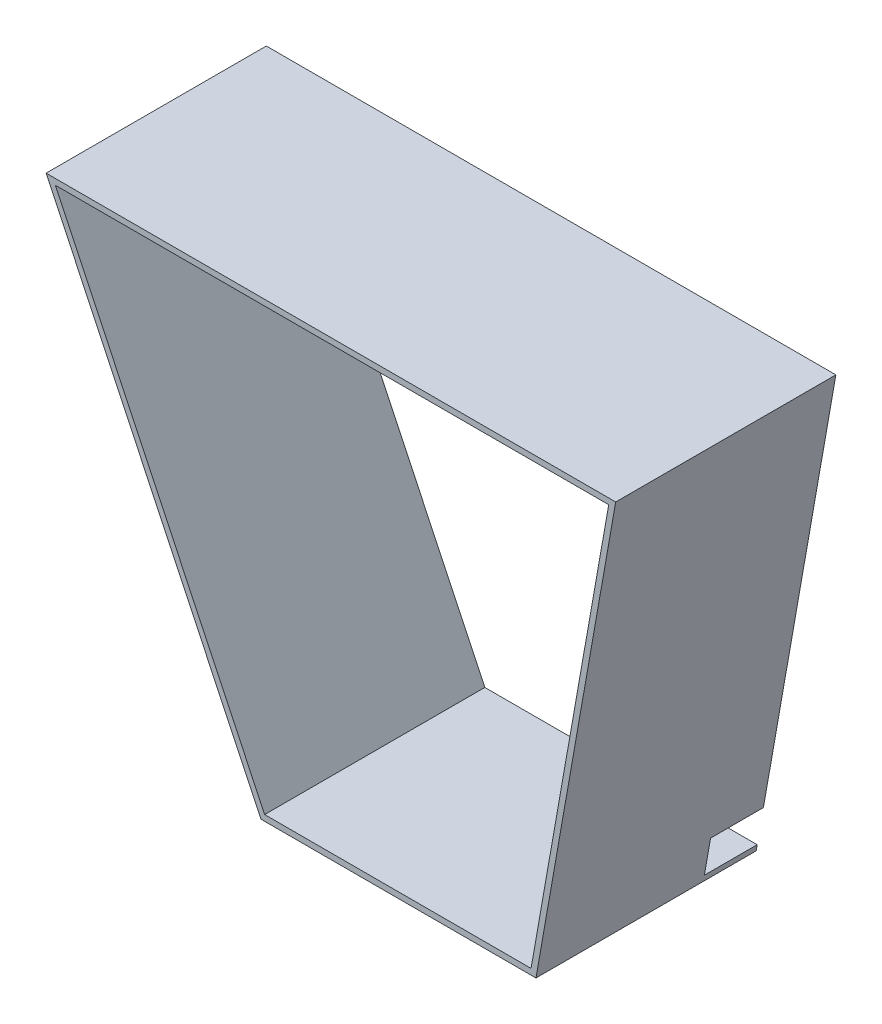
ISO-10303-21;
HEADER;
FILE_DESCRIPTION(('STEP AP214'),'2;1');
FILE_NAME('part.step','',(''),(''),'','','');
FILE_SCHEMA(('AUTOMOTIVE_DESIGN { 1 0 10303 214 1 1 1 1 }'));
ENDSEC;
DATA;
#1=APPLICATION_CONTEXT('core data for automotive mechanical design processes');
#2=APPLICATION_PROTOCOL_DEFINITION('international standard','automotive_design',2000,#1);
#3=PRODUCT_CONTEXT('',#1,'mechanical');
#4=PRODUCT('Part','Part','',(#3));
#5=PRODUCT_RELATED_PRODUCT_CATEGORY('part','',(#4));
#6=PRODUCT_DEFINITION_FORMATION('','',#4);
#7=PRODUCT_DEFINITION_CONTEXT('part definition',#1,'design');
#8=PRODUCT_DEFINITION('design','',#6,#7);
#9=PRODUCT_DEFINITION_SHAPE('','',#8);
#10=(LENGTH_UNIT() NAMED_UNIT(*) SI_UNIT(.MILLI.,.METRE.));
#11=(NAMED_UNIT(*) PLANE_ANGLE_UNIT() SI_UNIT($,.RADIAN.));
#12=(NAMED_UNIT(*) SI_UNIT($,.STERADIAN.) SOLID_ANGLE_UNIT());
#13=UNCERTAINTY_MEASURE_WITH_UNIT(LENGTH_MEASURE(1.E-05),#10,'distance_accuracy_value','');
#14=(GEOMETRIC_REPRESENTATION_CONTEXT(3) GLOBAL_UNCERTAINTY_ASSIGNED_CONTEXT((#13)) GLOBAL_UNIT_ASSIGNED_CONTEXT((#10,
#11,#12)) REPRESENTATION_CONTEXT('',''));
#15=CARTESIAN_POINT('',(0.,0.,0.));
#16=DIRECTION('',(0.,0.,1.));
#17=DIRECTION('',(1.,0.,0.));
#18=AXIS2_PLACEMENT_3D('',#15,#16,#17);
#19=CARTESIAN_POINT('',(-138.996457585162,0.,0.));
#20=DIRECTION('',(0.,-1.,0.));
#21=DIRECTION('',(1.,0.,0.));
#22=AXIS2_PLACEMENT_3D('',#19,#20,#21);
#23=PLANE('',#22);
#24=DIRECTION('',(0.,0.,1.));
#25=VECTOR('',#24,1.);
#26=CARTESIAN_POINT('',(-138.996457585162,0.,0.));
#27=LINE('',#26,#25);
#28=CARTESIAN_POINT('',(-138.996457585162,0.,0.));
#29=VERTEX_POINT('',#28);
#30=CARTESIAN_POINT('',(-138.996457585162,0.,150.));
#31=VERTEX_POINT('',#30);
#32=EDGE_CURVE('E11',#29,#31,#27,.T.);
#33=ORIENTED_EDGE('',*,*,#32,.T.);
#34=DIRECTION('',(1.,0.,0.));
#35=VECTOR('',#34,1.);
#36=CARTESIAN_POINT('',(-138.996457585162,0.,150.));
#37=LINE('',#36,#35);
#38=CARTESIAN_POINT('',(42.500000000013,0.,150.));
#39=VERTEX_POINT('',#38);
#40=EDGE_CURVE('E184',#31,#39,#37,.T.);
#41=ORIENTED_EDGE('',*,*,#40,.T.);
#42=DIRECTION('',(0.,0.,1.));
#43=VECTOR('',#42,1.);
#44=CARTESIAN_POINT('',(42.500000000013,0.,36.));
#45=LINE('',#44,#43);
#46=CARTESIAN_POINT('',(42.500000000013,0.,36.));
#47=VERTEX_POINT('',#46);
#48=EDGE_CURVE('E177',#47,#39,#45,.T.);
#49=ORIENTED_EDGE('',*,*,#48,.F.);
#50=DIRECTION('',(-1.,0.,0.));
#51=VECTOR('',#50,1.);
#52=CARTESIAN_POINT('',(46.561706447556,0.,36.));
#53=LINE('',#52,#51);
#54=CARTESIAN_POINT('',(46.5617064475559,0.,36.));
#55=VERTEX_POINT('',#54);
#56=EDGE_CURVE('E170',#55,#47,#53,.T.);
#57=ORIENTED_EDGE('',*,*,#56,.F.);
#58=DIRECTION('',(0.,0.,-1.));
#59=VECTOR('',#58,1.);
#60=CARTESIAN_POINT('',(46.5617064475559,0.,36.));
#61=LINE('',#60,#59);
#62=CARTESIAN_POINT('',(46.5617064475559,0.,0.));
#63=VERTEX_POINT('',#62);
#64=EDGE_CURVE('E159',#55,#63,#61,.T.);
#65=ORIENTED_EDGE('',*,*,#64,.T.);
#66=DIRECTION('',(1.,0.,0.));
#67=VECTOR('',#66,1.);
#68=CARTESIAN_POINT('',(-138.996457585162,0.,0.));
#69=LINE('',#68,#67);
#70=EDGE_CURVE('E150',#29,#63,#69,.T.);
#71=ORIENTED_EDGE('',*,*,#70,.F.);
#72=EDGE_LOOP('',(#33,#41,#49,#57,#65,#71));
#73=FACE_BOUND('',#72,.T.);
#74=ADVANCED_FACE('F16',(#73),#23,.F.);
#75=CARTESIAN_POINT('',(42.500000000013,0.,0.));
#76=DIRECTION('',(0.984807753012208,-0.17364817766693,0.));
#77=DIRECTION('',(0.17364817766693,0.984807753012208,0.));
#78=AXIS2_PLACEMENT_3D('',#75,#76,#77);
#79=PLANE('',#78);
#80=DIRECTION('',(0.,0.,1.));
#81=VECTOR('',#80,1.);
#82=CARTESIAN_POINT('',(46.7318475370161,24.,0.));
#83=LINE('',#82,#81);
#84=CARTESIAN_POINT('',(46.7318475370161,24.,0.));
#85=VERTEX_POINT('',#84);
#86=CARTESIAN_POINT('',(46.7318475370161,24.,36.));
#87=VERTEX_POINT('',#86);
#88=EDGE_CURVE('E23',#85,#87,#83,.T.);
#89=ORIENTED_EDGE('',*,*,#88,.T.);
#90=DIRECTION('',(-0.17364817766693,-0.984807753012208,0.));
#91=VECTOR('',#90,1.);
#92=CARTESIAN_POINT('',(46.7318475370161,24.,36.));
#93=LINE('',#92,#91);
#94=EDGE_CURVE('E180',#87,#47,#93,.T.);
#95=ORIENTED_EDGE('',*,*,#94,.T.);
#96=ORIENTED_EDGE('',*,*,#48,.T.);
#97=DIRECTION('',(0.17364817766693,0.984807753012208,0.));
#98=VECTOR('',#97,1.);
#99=CARTESIAN_POINT('',(42.500000000013,0.,150.));
#100=LINE('',#99,#98);
#101=CARTESIAN_POINT('',(95.3980942125525,300.,150.));
#102=VERTEX_POINT('',#101);
#103=EDGE_CURVE('E161',#39,#102,#100,.T.);
#104=ORIENTED_EDGE('',*,*,#103,.T.);
#105=DIRECTION('',(0.,0.,1.));
#106=VECTOR('',#105,1.);
#107=CARTESIAN_POINT('',(95.3980942125525,300.,0.));
#108=LINE('',#107,#106);
#109=CARTESIAN_POINT('',(95.3980942125525,300.,0.));
#110=VERTEX_POINT('',#109);
#111=EDGE_CURVE('E153',#110,#102,#108,.T.);
#112=ORIENTED_EDGE('',*,*,#111,.F.);
#113=DIRECTION('',(0.17364817766693,0.984807753012208,0.));
#114=VECTOR('',#113,1.);
#115=CARTESIAN_POINT('',(46.7318475370161,24.,0.));
#116=LINE('',#115,#114);
#117=EDGE_CURVE('E173',#85,#110,#116,.T.);
#118=ORIENTED_EDGE('',*,*,#117,.F.);
#119=EDGE_LOOP('',(#89,#95,#96,#104,#112,#118));
#120=FACE_BOUND('',#119,.T.);
#121=ADVANCED_FACE('F190',(#120),#79,.F.);
#122=CARTESIAN_POINT('',(0.,0.,0.));
#123=DIRECTION('',(0.,0.,1.));
#124=DIRECTION('',(-1.,0.,0.));
#125=AXIS2_PLACEMENT_3D('',#122,#123,#124);
#126=PLANE('',#125);
#127=DIRECTION('',(-1.,0.,0.));
#128=VECTOR('',#127,1.);
#129=CARTESIAN_POINT('',(50.7935539845591,24.,0.));
#130=LINE('',#129,#128);
#131=CARTESIAN_POINT('',(50.7935539845591,24.,0.));
#132=VERTEX_POINT('',#131);
#133=EDGE_CURVE('E182',#132,#85,#130,.T.);
#134=ORIENTED_EDGE('',*,*,#133,.T.);
#135=ORIENTED_EDGE('',*,*,#117,.T.);
#136=DIRECTION('',(-1.,0.,0.));
#137=VECTOR('',#136,1.);
#138=CARTESIAN_POINT('',(95.3980942125525,300.,0.));
#139=LINE('',#138,#137);
#140=CARTESIAN_POINT('',(-281.535276658347,300.,0.));
#141=VERTEX_POINT('',#140);
#142=EDGE_CURVE('E163',#110,#141,#139,.T.);
#143=ORIENTED_EDGE('',*,*,#142,.T.);
#144=DIRECTION('',(0.42915217206039,-0.903232203376214,0.));
#145=VECTOR('',#144,1.);
#146=CARTESIAN_POINT('',(-281.535276658347,300.,0.));
#147=LINE('',#146,#145);
#148=EDGE_CURVE('E156',#141,#29,#147,.T.);
#149=ORIENTED_EDGE('',*,*,#148,.T.);
#150=ORIENTED_EDGE('',*,*,#70,.T.);
#151=DIRECTION('',(0.17364817766693,0.984807753012208,0.));
#152=VECTOR('',#151,1.);
#153=CARTESIAN_POINT('',(45.8563985247221,-4.,0.));
#154=LINE('',#153,#152);
#155=CARTESIAN_POINT('',(45.8563985247221,-4.,0.));
#156=VERTEX_POINT('',#155);
#157=EDGE_CURVE('E135',#156,#63,#154,.T.);
#158=ORIENTED_EDGE('',*,*,#157,.F.);
#159=DIRECTION('',(1.,0.,0.));
#160=VECTOR('',#159,1.);
#161=CARTESIAN_POINT('',(-141.5244800618,-4.,0.));
#162=LINE('',#161,#160);
#163=CARTESIAN_POINT('',(-141.5244800618,-4.,0.));
#164=VERTEX_POINT('',#163);
#165=EDGE_CURVE('E105',#164,#156,#162,.T.);
#166=ORIENTED_EDGE('',*,*,#165,.F.);
#167=DIRECTION('',(0.42915217206039,-0.903232203376214,0.));
#168=VECTOR('',#167,1.);
#169=CARTESIAN_POINT('',(-287.86433431027,304.,0.));
#170=LINE('',#169,#168);
#171=CARTESIAN_POINT('',(-287.86433431027,304.,0.));
#172=VERTEX_POINT('',#171);
#173=EDGE_CURVE('E97',#172,#164,#170,.T.);
#174=ORIENTED_EDGE('',*,*,#173,.F.);
#175=DIRECTION('',(-1.,0.,0.));
#176=VECTOR('',#175,1.);
#177=CARTESIAN_POINT('',(100.165108582929,304.,0.));
#178=LINE('',#177,#176);
#179=CARTESIAN_POINT('',(100.165108582929,304.,0.));
#180=VERTEX_POINT('',#179);
#181=EDGE_CURVE('E101',#180,#172,#178,.T.);
#182=ORIENTED_EDGE('',*,*,#181,.F.);
#183=DIRECTION('',(0.17364817766693,0.984807753012208,0.));
#184=VECTOR('',#183,1.);
#185=CARTESIAN_POINT('',(50.7935539845591,24.,0.));
#186=LINE('',#185,#184);
#187=EDGE_CURVE('E165',#132,#180,#186,.T.);
#188=ORIENTED_EDGE('',*,*,#187,.F.);
#189=EDGE_LOOP('',(#134,#135,#143,#149,#150,#158,#166,#174,#182,#188));
#190=FACE_BOUND('',#189,.T.);
#191=ADVANCED_FACE('F99',(#190),#126,.F.);
#192=CARTESIAN_POINT('',(46.4392310120618,-0.694592710667723,0.));
#193=DIRECTION('',(0.984807753012208,-0.17364817766693,0.));
#194=DIRECTION('',(0.17364817766693,0.984807753012208,0.));
#195=AXIS2_PLACEMENT_3D('',#192,#193,#194);
#196=PLANE('',#195);
#197=DIRECTION('',(0.,0.,1.));
#198=VECTOR('',#197,1.);
#199=CARTESIAN_POINT('',(50.7935539845591,24.,0.));
#200=LINE('',#199,#198);
#201=CARTESIAN_POINT('',(50.7935539845591,24.,36.));
#202=VERTEX_POINT('',#201);
#203=EDGE_CURVE('E175',#132,#202,#200,.T.);
#204=ORIENTED_EDGE('',*,*,#203,.F.);
#205=ORIENTED_EDGE('',*,*,#187,.T.);
#206=DIRECTION('',(0.,0.,1.));
#207=VECTOR('',#206,1.);
#208=CARTESIAN_POINT('',(100.165108582929,304.,0.));
#209=LINE('',#208,#207);
#210=CARTESIAN_POINT('',(100.165108582929,304.,150.));
#211=VERTEX_POINT('',#210);
#212=EDGE_CURVE('E119',#180,#211,#209,.T.);
#213=ORIENTED_EDGE('',*,*,#212,.T.);
#214=DIRECTION('',(0.17364817766693,0.984807753012208,0.));
#215=VECTOR('',#214,1.);
#216=CARTESIAN_POINT('',(45.8563985247221,-4.,150.));
#217=LINE('',#216,#215);
#218=CARTESIAN_POINT('',(45.8563985247221,-4.,150.));
#219=VERTEX_POINT('',#218);
#220=EDGE_CURVE('E143',#219,#211,#217,.T.);
#221=ORIENTED_EDGE('',*,*,#220,.F.);
#222=DIRECTION('',(0.,0.,1.));
#223=VECTOR('',#222,1.);
#224=CARTESIAN_POINT('',(45.8563985247221,-4.,0.));
#225=LINE('',#224,#223);
#226=EDGE_CURVE('E138',#156,#219,#225,.T.);
#227=ORIENTED_EDGE('',*,*,#226,.F.);
#228=ORIENTED_EDGE('',*,*,#157,.T.);
#229=ORIENTED_EDGE('',*,*,#64,.F.);
#230=DIRECTION('',(-0.17364817766693,-0.984807753012208,0.));
#231=VECTOR('',#230,1.);
#232=CARTESIAN_POINT('',(50.7935539845591,24.,36.));
#233=LINE('',#232,#231);
#234=EDGE_CURVE('E167',#202,#55,#233,.T.);
#235=ORIENTED_EDGE('',*,*,#234,.F.);
#236=EDGE_LOOP('',(#204,#205,#213,#221,#227,#228,#229,#235));
#237=FACE_BOUND('',#236,.T.);
#238=ADVANCED_FACE('F209',(#237),#196,.T.);
#239=CARTESIAN_POINT('',(101.338756760596,0.,36.));
#240=DIRECTION('',(0.,0.,1.));
#241=DIRECTION('',(0.,1.,0.));
#242=AXIS2_PLACEMENT_3D('',#239,#240,#241);
#243=PLANE('',#242);
#244=ORIENTED_EDGE('',*,*,#234,.T.);
#245=ORIENTED_EDGE('',*,*,#56,.T.);
#246=ORIENTED_EDGE('',*,*,#94,.F.);
#247=DIRECTION('',(-1.,0.,0.));
#248=VECTOR('',#247,1.);
#249=CARTESIAN_POINT('',(50.7935539845591,24.,36.));
#250=LINE('',#249,#248);
#251=EDGE_CURVE('E146',#202,#87,#250,.T.);
#252=ORIENTED_EDGE('',*,*,#251,.F.);
#253=EDGE_LOOP('',(#244,#245,#246,#252));
#254=FACE_BOUND('',#253,.T.);
#255=ADVANCED_FACE('F205',(#254),#243,.F.);
#256=CARTESIAN_POINT('',(101.338756760596,24.,36.));
#257=DIRECTION('',(0.,1.,0.));
#258=DIRECTION('',(0.,0.,-1.));
#259=AXIS2_PLACEMENT_3D('',#256,#257,#258);
#260=PLANE('',#259);
#261=ORIENTED_EDGE('',*,*,#203,.T.);
#262=ORIENTED_EDGE('',*,*,#251,.T.);
#263=ORIENTED_EDGE('',*,*,#88,.F.);
#264=ORIENTED_EDGE('',*,*,#133,.F.);
#265=EDGE_LOOP('',(#261,#262,#263,#264));
#266=FACE_BOUND('',#265,.T.);
#267=ADVANCED_FACE('F201',(#266),#260,.F.);
#268=CARTESIAN_POINT('',(-281.535276658347,300.,0.));
#269=DIRECTION('',(-0.903232203376214,-0.42915217206039,0.));
#270=DIRECTION('',(0.42915217206039,-0.903232203376214,0.));
#271=AXIS2_PLACEMENT_3D('',#268,#269,#270);
#272=PLANE('',#271);
#273=DIRECTION('',(0.,0.,1.));
#274=VECTOR('',#273,1.);
#275=CARTESIAN_POINT('',(-281.535276658347,300.,0.));
#276=LINE('',#275,#274);
#277=CARTESIAN_POINT('',(-281.535276658347,300.,150.));
#278=VERTEX_POINT('',#277);
#279=EDGE_CURVE('E148',#141,#278,#276,.T.);
#280=ORIENTED_EDGE('',*,*,#279,.T.);
#281=DIRECTION('',(0.42915217206039,-0.903232203376214,0.));
#282=VECTOR('',#281,1.);
#283=CARTESIAN_POINT('',(-281.535276658347,300.,150.));
#284=LINE('',#283,#282);
#285=EDGE_CURVE('E141',#278,#31,#284,.T.);
#286=ORIENTED_EDGE('',*,*,#285,.T.);
#287=ORIENTED_EDGE('',*,*,#32,.F.);
#288=ORIENTED_EDGE('',*,*,#148,.F.);
#289=EDGE_LOOP('',(#280,#286,#287,#288));
#290=FACE_BOUND('',#289,.T.);
#291=ADVANCED_FACE('F215',(#290),#272,.F.);
#292=CARTESIAN_POINT('',(0.,0.,150.));
#293=DIRECTION('',(0.,0.,1.));
#294=DIRECTION('',(-1.,0.,0.));
#295=AXIS2_PLACEMENT_3D('',#292,#293,#294);
#296=PLANE('',#295);
#297=ORIENTED_EDGE('',*,*,#220,.T.);
#298=DIRECTION('',(-1.,0.,0.));
#299=VECTOR('',#298,1.);
#300=CARTESIAN_POINT('',(100.165108582929,304.,150.));
#301=LINE('',#300,#299);
#302=CARTESIAN_POINT('',(-287.86433431027,304.,150.));
#303=VERTEX_POINT('',#302);
#304=EDGE_CURVE('E133',#211,#303,#301,.T.);
#305=ORIENTED_EDGE('',*,*,#304,.T.);
#306=DIRECTION('',(0.42915217206039,-0.903232203376214,0.));
#307=VECTOR('',#306,1.);
#308=CARTESIAN_POINT('',(-287.86433431027,304.,150.));
#309=LINE('',#308,#307);
#310=CARTESIAN_POINT('',(-141.5244800618,-4.,150.));
#311=VERTEX_POINT('',#310);
#312=EDGE_CURVE('E110',#303,#311,#309,.T.);
#313=ORIENTED_EDGE('',*,*,#312,.T.);
#314=DIRECTION('',(1.,0.,0.));
#315=VECTOR('',#314,1.);
#316=CARTESIAN_POINT('',(-141.5244800618,-4.,150.));
#317=LINE('',#316,#315);
#318=EDGE_CURVE('E111',#311,#219,#317,.T.);
#319=ORIENTED_EDGE('',*,*,#318,.T.);
#320=EDGE_LOOP('',(#297,#305,#313,#319));
#321=FACE_BOUND('',#320,.T.);
#322=ORIENTED_EDGE('',*,*,#40,.F.);
#323=ORIENTED_EDGE('',*,*,#285,.F.);
#324=DIRECTION('',(-1.,0.,0.));
#325=VECTOR('',#324,1.);
#326=CARTESIAN_POINT('',(95.3980942125525,300.,150.));
#327=LINE('',#326,#325);
#328=EDGE_CURVE('E129',#102,#278,#327,.T.);
#329=ORIENTED_EDGE('',*,*,#328,.F.);
#330=ORIENTED_EDGE('',*,*,#103,.F.);
#331=EDGE_LOOP('',(#322,#323,#329,#330));
#332=FACE_BOUND('',#331,.T.);
#333=ADVANCED_FACE('F194',(#321,#332),#296,.T.);
#334=CARTESIAN_POINT('',(95.3980942125525,300.,0.));
#335=DIRECTION('',(0.,1.,0.));
#336=DIRECTION('',(-1.,0.,0.));
#337=AXIS2_PLACEMENT_3D('',#334,#335,#336);
#338=PLANE('',#337);
#339=ORIENTED_EDGE('',*,*,#111,.T.);
#340=ORIENTED_EDGE('',*,*,#328,.T.);
#341=ORIENTED_EDGE('',*,*,#279,.F.);
#342=ORIENTED_EDGE('',*,*,#142,.F.);
#343=EDGE_LOOP('',(#339,#340,#341,#342));
#344=FACE_BOUND('',#343,.T.);
#345=ADVANCED_FACE('F197',(#344),#338,.F.);
#346=CARTESIAN_POINT('',(-138.996457585162,-4.,0.));
#347=DIRECTION('',(0.,-1.,0.));
#348=DIRECTION('',(1.,0.,0.));
#349=AXIS2_PLACEMENT_3D('',#346,#347,#348);
#350=PLANE('',#349);
#351=ORIENTED_EDGE('',*,*,#165,.T.);
#352=ORIENTED_EDGE('',*,*,#226,.T.);
#353=ORIENTED_EDGE('',*,*,#318,.F.);
#354=DIRECTION('',(0.,0.,1.));
#355=VECTOR('',#354,1.);
#356=CARTESIAN_POINT('',(-141.5244800618,-4.,0.));
#357=LINE('',#356,#355);
#358=EDGE_CURVE('E120',#164,#311,#357,.T.);
#359=ORIENTED_EDGE('',*,*,#358,.F.);
#360=EDGE_LOOP('',(#351,#352,#353,#359));
#361=FACE_BOUND('',#360,.T.);
#362=ADVANCED_FACE('F212',(#361),#350,.T.);
#363=CARTESIAN_POINT('',(-285.148205471852,298.283391311759,0.));
#364=DIRECTION('',(-0.903232203376214,-0.42915217206039,0.));
#365=DIRECTION('',(0.42915217206039,-0.903232203376214,0.));
#366=AXIS2_PLACEMENT_3D('',#363,#364,#365);
#367=PLANE('',#366);
#368=ORIENTED_EDGE('',*,*,#173,.T.);
#369=ORIENTED_EDGE('',*,*,#358,.T.);
#370=ORIENTED_EDGE('',*,*,#312,.F.);
#371=DIRECTION('',(0.,0.,1.));
#372=VECTOR('',#371,1.);
#373=CARTESIAN_POINT('',(-287.86433431027,304.,0.));
#374=LINE('',#373,#372);
#375=EDGE_CURVE('E117',#172,#303,#374,.T.);
#376=ORIENTED_EDGE('',*,*,#375,.F.);
#377=EDGE_LOOP('',(#368,#369,#370,#376));
#378=FACE_BOUND('',#377,.T.);
#379=ADVANCED_FACE('F122',(#378),#367,.T.);
#380=CARTESIAN_POINT('',(95.3980942125525,304.,0.));
#381=DIRECTION('',(0.,1.,0.));
#382=DIRECTION('',(-1.,0.,0.));
#383=AXIS2_PLACEMENT_3D('',#380,#381,#382);
#384=PLANE('',#383);
#385=ORIENTED_EDGE('',*,*,#181,.T.);
#386=ORIENTED_EDGE('',*,*,#375,.T.);
#387=ORIENTED_EDGE('',*,*,#304,.F.);
#388=ORIENTED_EDGE('',*,*,#212,.F.);
#389=EDGE_LOOP('',(#385,#386,#387,#388));
#390=FACE_BOUND('',#389,.T.);
#391=ADVANCED_FACE('F115',(#390),#384,.T.);
#392=CLOSED_SHELL('',(#74,#121,#191,#238,#255,#267,#291,#333,#345,#362,#379,#391));
#393=MANIFOLD_SOLID_BREP('B1',#392);
#394=ADVANCED_BREP_SHAPE_REPRESENTATION('',(#18,#393),#14);
#395=SHAPE_DEFINITION_REPRESENTATION(#9,#394);
ENDSEC;
END-ISO-10303-21;
